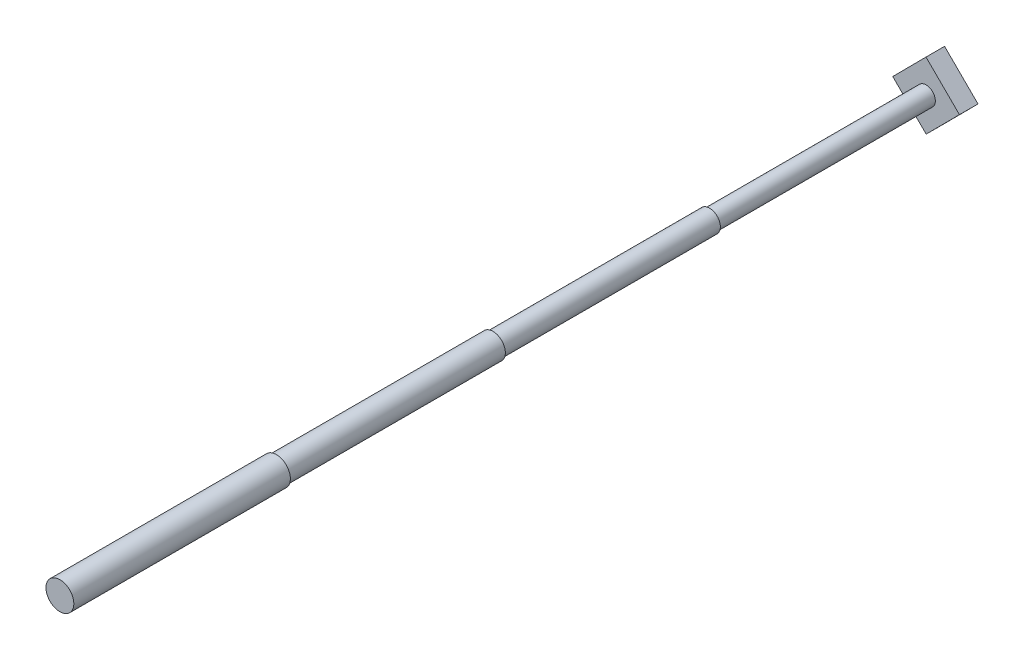
ISO-10303-21;
HEADER;
FILE_DESCRIPTION(('STEP AP214'),'2;1');
FILE_NAME('part.step','',(''),(''),'','','');
FILE_SCHEMA(('AUTOMOTIVE_DESIGN { 1 0 10303 214 1 1 1 1 }'));
ENDSEC;
DATA;
#1=APPLICATION_CONTEXT('core data for automotive mechanical design processes');
#2=APPLICATION_PROTOCOL_DEFINITION('international standard','automotive_design',2000,#1);
#3=PRODUCT_CONTEXT('',#1,'mechanical');
#4=PRODUCT('Part','Part','',(#3));
#5=PRODUCT_RELATED_PRODUCT_CATEGORY('part','',(#4));
#6=PRODUCT_DEFINITION_FORMATION('','',#4);
#7=PRODUCT_DEFINITION_CONTEXT('part definition',#1,'design');
#8=PRODUCT_DEFINITION('design','',#6,#7);
#9=PRODUCT_DEFINITION_SHAPE('','',#8);
#10=(LENGTH_UNIT() NAMED_UNIT(*) SI_UNIT(.MILLI.,.METRE.));
#11=(NAMED_UNIT(*) PLANE_ANGLE_UNIT() SI_UNIT($,.RADIAN.));
#12=(NAMED_UNIT(*) SI_UNIT($,.STERADIAN.) SOLID_ANGLE_UNIT());
#13=UNCERTAINTY_MEASURE_WITH_UNIT(LENGTH_MEASURE(1.E-05),#10,'distance_accuracy_value','');
#14=(GEOMETRIC_REPRESENTATION_CONTEXT(3) GLOBAL_UNCERTAINTY_ASSIGNED_CONTEXT((#13)) GLOBAL_UNIT_ASSIGNED_CONTEXT((#10,
#11,#12)) REPRESENTATION_CONTEXT('',''));
#15=CARTESIAN_POINT('',(0.,0.,0.));
#16=DIRECTION('',(0.,0.,1.));
#17=DIRECTION('',(1.,0.,0.));
#18=AXIS2_PLACEMENT_3D('',#15,#16,#17);
#19=CARTESIAN_POINT('',(-5.05597950018379,0.208317708847282,-1400.));
#20=DIRECTION('',(0.,0.,-1.));
#21=DIRECTION('',(-1.,0.,0.));
#22=AXIS2_PLACEMENT_3D('',#19,#20,#21);
#23=PLANE('',#22);
#24=CARTESIAN_POINT('',(-5.05597950018379,0.208317708847282,-1400.));
#25=DIRECTION('',(0.,0.,-1.));
#26=DIRECTION('',(-1.,0.,0.));
#27=AXIS2_PLACEMENT_3D('',#24,#25,#26);
#28=CIRCLE('',#27,35.);
#29=CARTESIAN_POINT('',(-40.0559795001838,0.208317708847282,-1400.));
#30=VERTEX_POINT('',#29);
#31=EDGE_CURVE('E117',#30,#30,#28,.T.);
#32=ORIENTED_EDGE('',*,*,#31,.T.);
#33=EDGE_LOOP('',(#32));
#34=FACE_BOUND('',#33,.T.);
#35=CARTESIAN_POINT('',(-5.05597950018379,0.208317708847282,-1400.));
#36=DIRECTION('',(0.,0.,-1.));
#37=DIRECTION('',(-1.,0.,0.));
#38=AXIS2_PLACEMENT_3D('',#35,#36,#37);
#39=CIRCLE('',#38,30.);
#40=CARTESIAN_POINT('',(-35.0559795001838,0.208317708847282,-1400.));
#41=VERTEX_POINT('',#40);
#42=EDGE_CURVE('E110',#41,#41,#39,.T.);
#43=ORIENTED_EDGE('',*,*,#42,.F.);
#44=EDGE_LOOP('',(#43));
#45=FACE_BOUND('',#44,.T.);
#46=ADVANCED_FACE('F33',(#34,#45),#23,.T.);
#47=CARTESIAN_POINT('',(-5.05597950018379,0.208317708847282,-700.));
#48=DIRECTION('',(0.,0.,-1.));
#49=DIRECTION('',(-1.,0.,0.));
#50=AXIS2_PLACEMENT_3D('',#47,#48,#49);
#51=PLANE('',#50);
#52=CARTESIAN_POINT('',(-5.05597950018379,0.208317708847282,-700.));
#53=DIRECTION('',(0.,0.,-1.));
#54=DIRECTION('',(-1.,0.,0.));
#55=AXIS2_PLACEMENT_3D('',#52,#53,#54);
#56=CIRCLE('',#55,40.);
#57=CARTESIAN_POINT('',(-45.0559795001838,0.208317708847282,-700.));
#58=VERTEX_POINT('',#57);
#59=EDGE_CURVE('E120',#58,#58,#56,.T.);
#60=ORIENTED_EDGE('',*,*,#59,.T.);
#61=EDGE_LOOP('',(#60));
#62=FACE_BOUND('',#61,.T.);
#63=CARTESIAN_POINT('',(-5.05597950018379,0.208317708847282,-700.));
#64=DIRECTION('',(0.,0.,-1.));
#65=DIRECTION('',(-1.,0.,0.));
#66=AXIS2_PLACEMENT_3D('',#63,#64,#65);
#67=CIRCLE('',#66,35.);
#68=CARTESIAN_POINT('',(-40.0559795001838,0.208317708847282,-700.));
#69=VERTEX_POINT('',#68);
#70=EDGE_CURVE('E114',#69,#69,#67,.T.);
#71=ORIENTED_EDGE('',*,*,#70,.F.);
#72=EDGE_LOOP('',(#71));
#73=FACE_BOUND('',#72,.T.);
#74=ADVANCED_FACE('F134',(#62,#73),#51,.T.);
#75=CARTESIAN_POINT('',(-5.05597950018379,0.208317708847282,0.));
#76=DIRECTION('',(0.,0.,1.));
#77=DIRECTION('',(1.,0.,0.));
#78=AXIS2_PLACEMENT_3D('',#75,#76,#77);
#79=PLANE('',#78);
#80=CARTESIAN_POINT('',(-5.05597950018379,0.208317708847282,0.));
#81=DIRECTION('',(0.,0.,1.));
#82=DIRECTION('',(1.,0.,0.));
#83=AXIS2_PLACEMENT_3D('',#80,#81,#82);
#84=CIRCLE('',#83,45.);
#85=CARTESIAN_POINT('',(39.9440204998162,0.208317708847282,0.));
#86=VERTEX_POINT('',#85);
#87=EDGE_CURVE('E125',#86,#86,#84,.T.);
#88=ORIENTED_EDGE('',*,*,#87,.F.);
#89=EDGE_LOOP('',(#88));
#90=FACE_BOUND('',#89,.T.);
#91=CARTESIAN_POINT('',(-5.05597950018379,0.208317708847282,0.));
#92=DIRECTION('',(0.,0.,1.));
#93=DIRECTION('',(1.,0.,0.));
#94=AXIS2_PLACEMENT_3D('',#91,#92,#93);
#95=CIRCLE('',#94,40.);
#96=CARTESIAN_POINT('',(34.9440204998162,0.208317708847282,0.));
#97=VERTEX_POINT('',#96);
#98=EDGE_CURVE('E11',#97,#97,#95,.F.);
#99=ORIENTED_EDGE('',*,*,#98,.F.);
#100=EDGE_LOOP('',(#99));
#101=FACE_BOUND('',#100,.T.);
#102=ADVANCED_FACE('F131',(#90,#101),#79,.F.);
#103=CARTESIAN_POINT('',(-5.05597950018379,0.208317708847282,700.));
#104=DIRECTION('',(0.,0.,-1.));
#105=DIRECTION('',(-1.,0.,0.));
#106=AXIS2_PLACEMENT_3D('',#103,#104,#105);
#107=CYLINDRICAL_SURFACE('',#106,45.);
#108=CARTESIAN_POINT('',(-5.05597950018379,0.208317708847282,700.));
#109=DIRECTION('',(0.,0.,1.));
#110=DIRECTION('',(1.,0.,0.));
#111=AXIS2_PLACEMENT_3D('',#108,#109,#110);
#112=CIRCLE('',#111,45.);
#113=CARTESIAN_POINT('',(39.9440204998162,0.208317708847282,700.));
#114=VERTEX_POINT('',#113);
#115=EDGE_CURVE('E42',#114,#114,#112,.T.);
#116=ORIENTED_EDGE('',*,*,#115,.F.);
#117=EDGE_LOOP('',(#116));
#118=FACE_BOUND('',#117,.T.);
#119=ORIENTED_EDGE('',*,*,#87,.T.);
#120=EDGE_LOOP('',(#119));
#121=FACE_BOUND('',#120,.T.);
#122=ADVANCED_FACE('F35',(#118,#121),#107,.T.);
#123=CARTESIAN_POINT('',(-5.05597950018379,0.208317708847282,700.));
#124=DIRECTION('',(0.,0.,1.));
#125=DIRECTION('',(1.,0.,0.));
#126=AXIS2_PLACEMENT_3D('',#123,#124,#125);
#127=PLANE('',#126);
#128=ORIENTED_EDGE('',*,*,#115,.T.);
#129=EDGE_LOOP('',(#128));
#130=FACE_BOUND('',#129,.T.);
#131=ADVANCED_FACE('F140',(#130),#127,.T.);
#132=CARTESIAN_POINT('',(-5.05597950018379,0.208317708847282,-700.));
#133=DIRECTION('',(0.,0.,1.));
#134=DIRECTION('',(1.,0.,0.));
#135=AXIS2_PLACEMENT_3D('',#132,#133,#134);
#136=CYLINDRICAL_SURFACE('',#135,40.);
#137=ORIENTED_EDGE('',*,*,#59,.F.);
#138=EDGE_LOOP('',(#137));
#139=FACE_BOUND('',#138,.T.);
#140=ORIENTED_EDGE('',*,*,#98,.T.);
#141=EDGE_LOOP('',(#140));
#142=FACE_BOUND('',#141,.T.);
#143=ADVANCED_FACE('F137',(#139,#142),#136,.T.);
#144=CARTESIAN_POINT('',(-5.05597950018379,0.208317708847282,-1400.));
#145=DIRECTION('',(0.,0.,1.));
#146=DIRECTION('',(1.,0.,0.));
#147=AXIS2_PLACEMENT_3D('',#144,#145,#146);
#148=CYLINDRICAL_SURFACE('',#147,35.);
#149=ORIENTED_EDGE('',*,*,#31,.F.);
#150=EDGE_LOOP('',(#149));
#151=FACE_BOUND('',#150,.T.);
#152=ORIENTED_EDGE('',*,*,#70,.T.);
#153=EDGE_LOOP('',(#152));
#154=FACE_BOUND('',#153,.T.);
#155=ADVANCED_FACE('F139',(#151,#154),#148,.T.);
#156=CARTESIAN_POINT('',(-5.05597950018379,0.208317708847282,-2100.));
#157=DIRECTION('',(0.,0.,1.));
#158=DIRECTION('',(1.,0.,0.));
#159=AXIS2_PLACEMENT_3D('',#156,#157,#158);
#160=CYLINDRICAL_SURFACE('',#159,30.);
#161=CARTESIAN_POINT('',(-5.05597950018379,0.208317708847282,-2100.));
#162=DIRECTION('',(0.,0.,-1.));
#163=DIRECTION('',(-1.,0.,0.));
#164=AXIS2_PLACEMENT_3D('',#161,#162,#163);
#165=CIRCLE('',#164,30.);
#166=CARTESIAN_POINT('',(-35.0559795001838,0.208317708847282,-2100.));
#167=VERTEX_POINT('',#166);
#168=EDGE_CURVE('E111',#167,#167,#165,.T.);
#169=ORIENTED_EDGE('',*,*,#168,.F.);
#170=EDGE_LOOP('',(#169));
#171=FACE_BOUND('',#170,.T.);
#172=ORIENTED_EDGE('',*,*,#42,.T.);
#173=EDGE_LOOP('',(#172));
#174=FACE_BOUND('',#173,.T.);
#175=ADVANCED_FACE('F147',(#171,#174),#160,.T.);
#176=CARTESIAN_POINT('',(102.745053565891,0.70731423377024,-2100.));
#177=DIRECTION('',(0.,0.,1.));
#178=DIRECTION('',(1.,0.,0.));
#179=AXIS2_PLACEMENT_3D('',#176,#177,#178);
#180=PLANE('',#179);
#181=DIRECTION('',(-0.704647456666012,-0.709557581746627,0.));
#182=VECTOR('',#181,1.);
#183=CARTESIAN_POINT('',(-4.78592262074994,-107.572959403848,-2100.));
#184=LINE('',#183,#182);
#185=CARTESIAN_POINT('',(102.745053565891,0.70731423377024,-2100.));
#186=VERTEX_POINT('',#185);
#187=CARTESIAN_POINT('',(-4.78592262074994,-107.572959403848,-2100.));
#188=VERTEX_POINT('',#187);
#189=EDGE_CURVE('E101',#186,#188,#184,.T.);
#190=ORIENTED_EDGE('',*,*,#189,.F.);
#191=DIRECTION('',(0.709557581746627,-0.704647456666011,0.));
#192=VECTOR('',#191,1.);
#193=CARTESIAN_POINT('',(102.745053565891,0.70731423377024,-2100.));
#194=LINE('',#193,#192);
#195=CARTESIAN_POINT('',(-5.30555714638839,108.010216758184,-2100.));
#196=VERTEX_POINT('',#195);
#197=EDGE_CURVE('E73',#196,#186,#194,.T.);
#198=ORIENTED_EDGE('',*,*,#197,.F.);
#199=DIRECTION('',(0.704647456666012,0.709557581746627,0.));
#200=VECTOR('',#199,1.);
#201=CARTESIAN_POINT('',(-112.83653333303,-0.270056879433864,-2100.));
#202=LINE('',#201,#200);
#203=CARTESIAN_POINT('',(-112.83653333303,-0.270056879433864,-2100.));
#204=VERTEX_POINT('',#203);
#205=EDGE_CURVE('E67',#204,#196,#202,.T.);
#206=ORIENTED_EDGE('',*,*,#205,.F.);
#207=DIRECTION('',(-0.709557581746627,0.704647456666012,0.));
#208=VECTOR('',#207,1.);
#209=CARTESIAN_POINT('',(-4.78592262074994,-107.572959403848,-2100.));
#210=LINE('',#209,#208);
#211=EDGE_CURVE('E91',#188,#204,#210,.T.);
#212=ORIENTED_EDGE('',*,*,#211,.F.);
#213=EDGE_LOOP('',(#190,#198,#206,#212));
#214=FACE_BOUND('',#213,.T.);
#215=ORIENTED_EDGE('',*,*,#168,.T.);
#216=EDGE_LOOP('',(#215));
#217=FACE_BOUND('',#216,.T.);
#218=ADVANCED_FACE('F165',(#214,#217),#180,.T.);
#219=CARTESIAN_POINT('',(-4.78592262074994,-107.572959403848,-2160.));
#220=DIRECTION('',(-0.709557581746627,0.704647456666012,0.));
#221=DIRECTION('',(-0.704647456666012,-0.709557581746627,0.));
#222=AXIS2_PLACEMENT_3D('',#219,#220,#221);
#223=PLANE('',#222);
#224=ORIENTED_EDGE('',*,*,#189,.T.);
#225=DIRECTION('',(0.,0.,1.));
#226=VECTOR('',#225,1.);
#227=CARTESIAN_POINT('',(-4.78592262074994,-107.572959403848,-2160.));
#228=LINE('',#227,#226);
#229=CARTESIAN_POINT('',(-4.78592262074994,-107.572959403848,-2160.));
#230=VERTEX_POINT('',#229);
#231=EDGE_CURVE('E92',#230,#188,#228,.T.);
#232=ORIENTED_EDGE('',*,*,#231,.F.);
#233=DIRECTION('',(-0.704647456666012,-0.709557581746627,0.));
#234=VECTOR('',#233,1.);
#235=CARTESIAN_POINT('',(-4.78592262074994,-107.572959403848,-2160.));
#236=LINE('',#235,#234);
#237=CARTESIAN_POINT('',(102.745053565891,0.70731423377024,-2160.));
#238=VERTEX_POINT('',#237);
#239=EDGE_CURVE('E86',#238,#230,#236,.T.);
#240=ORIENTED_EDGE('',*,*,#239,.F.);
#241=DIRECTION('',(0.,0.,1.));
#242=VECTOR('',#241,1.);
#243=CARTESIAN_POINT('',(102.745053565891,0.70731423377024,-2160.));
#244=LINE('',#243,#242);
#245=EDGE_CURVE('E97',#238,#186,#244,.T.);
#246=ORIENTED_EDGE('',*,*,#245,.T.);
#247=EDGE_LOOP('',(#224,#232,#240,#246));
#248=FACE_BOUND('',#247,.T.);
#249=ADVANCED_FACE('F167',(#248),#223,.F.);
#250=CARTESIAN_POINT('',(-4.78592262074994,-107.572959403848,-2160.));
#251=DIRECTION('',(0.704647456666012,0.709557581746627,0.));
#252=DIRECTION('',(-0.709557581746627,0.704647456666012,0.));
#253=AXIS2_PLACEMENT_3D('',#250,#251,#252);
#254=PLANE('',#253);
#255=ORIENTED_EDGE('',*,*,#211,.T.);
#256=DIRECTION('',(0.,0.,1.));
#257=VECTOR('',#256,1.);
#258=CARTESIAN_POINT('',(-112.83653333303,-0.270056879433864,-2160.));
#259=LINE('',#258,#257);
#260=CARTESIAN_POINT('',(-112.83653333303,-0.270056879433864,-2160.));
#261=VERTEX_POINT('',#260);
#262=EDGE_CURVE('E89',#261,#204,#259,.T.);
#263=ORIENTED_EDGE('',*,*,#262,.F.);
#264=DIRECTION('',(-0.709557581746627,0.704647456666012,0.));
#265=VECTOR('',#264,1.);
#266=CARTESIAN_POINT('',(-4.78592262074994,-107.572959403848,-2160.));
#267=LINE('',#266,#265);
#268=EDGE_CURVE('E81',#230,#261,#267,.T.);
#269=ORIENTED_EDGE('',*,*,#268,.F.);
#270=ORIENTED_EDGE('',*,*,#231,.T.);
#271=EDGE_LOOP('',(#255,#263,#269,#270));
#272=FACE_BOUND('',#271,.T.);
#273=ADVANCED_FACE('F90',(#272),#254,.F.);
#274=CARTESIAN_POINT('',(-112.83653333303,-0.270056879433864,-2160.));
#275=DIRECTION('',(0.709557581746627,-0.704647456666012,0.));
#276=DIRECTION('',(0.704647456666012,0.709557581746627,0.));
#277=AXIS2_PLACEMENT_3D('',#274,#275,#276);
#278=PLANE('',#277);
#279=ORIENTED_EDGE('',*,*,#205,.T.);
#280=DIRECTION('',(0.,0.,1.));
#281=VECTOR('',#280,1.);
#282=CARTESIAN_POINT('',(-5.30555714638839,108.010216758184,-2160.));
#283=LINE('',#282,#281);
#284=CARTESIAN_POINT('',(-5.30555714638839,108.010216758184,-2160.));
#285=VERTEX_POINT('',#284);
#286=EDGE_CURVE('E93',#285,#196,#283,.T.);
#287=ORIENTED_EDGE('',*,*,#286,.F.);
#288=DIRECTION('',(0.704647456666012,0.709557581746627,0.));
#289=VECTOR('',#288,1.);
#290=CARTESIAN_POINT('',(-112.83653333303,-0.270056879433864,-2160.));
#291=LINE('',#290,#289);
#292=EDGE_CURVE('E84',#261,#285,#291,.T.);
#293=ORIENTED_EDGE('',*,*,#292,.F.);
#294=ORIENTED_EDGE('',*,*,#262,.T.);
#295=EDGE_LOOP('',(#279,#287,#293,#294));
#296=FACE_BOUND('',#295,.T.);
#297=ADVANCED_FACE('F95',(#296),#278,.F.);
#298=CARTESIAN_POINT('',(102.745053565891,0.70731423377024,-2160.));
#299=DIRECTION('',(-0.704647456666011,-0.709557581746627,0.));
#300=DIRECTION('',(0.709557581746627,-0.704647456666011,0.));
#301=AXIS2_PLACEMENT_3D('',#298,#299,#300);
#302=PLANE('',#301);
#303=ORIENTED_EDGE('',*,*,#197,.T.);
#304=ORIENTED_EDGE('',*,*,#245,.F.);
#305=DIRECTION('',(0.709557581746627,-0.704647456666011,0.));
#306=VECTOR('',#305,1.);
#307=CARTESIAN_POINT('',(102.745053565891,0.70731423377024,-2160.));
#308=LINE('',#307,#306);
#309=EDGE_CURVE('E50',#285,#238,#308,.T.);
#310=ORIENTED_EDGE('',*,*,#309,.F.);
#311=ORIENTED_EDGE('',*,*,#286,.T.);
#312=EDGE_LOOP('',(#303,#304,#310,#311));
#313=FACE_BOUND('',#312,.T.);
#314=ADVANCED_FACE('F175',(#313),#302,.F.);
#315=CARTESIAN_POINT('',(102.745053565891,0.70731423377024,-2160.));
#316=DIRECTION('',(0.,0.,1.));
#317=DIRECTION('',(1.,0.,0.));
#318=AXIS2_PLACEMENT_3D('',#315,#316,#317);
#319=PLANE('',#318);
#320=ORIENTED_EDGE('',*,*,#239,.T.);
#321=ORIENTED_EDGE('',*,*,#268,.T.);
#322=ORIENTED_EDGE('',*,*,#292,.T.);
#323=ORIENTED_EDGE('',*,*,#309,.T.);
#324=EDGE_LOOP('',(#320,#321,#322,#323));
#325=FACE_BOUND('',#324,.T.);
#326=ADVANCED_FACE('F82',(#325),#319,.F.);
#327=CLOSED_SHELL('',(#46,#74,#102,#122,#131,#143,#155,#175,#218,#249,#273,#297,#314,#326));
#328=MANIFOLD_SOLID_BREP('B2',#327);
#329=ADVANCED_BREP_SHAPE_REPRESENTATION('',(#18,#328),#14);
#330=SHAPE_DEFINITION_REPRESENTATION(#9,#329);
ENDSEC;
END-ISO-10303-21;
